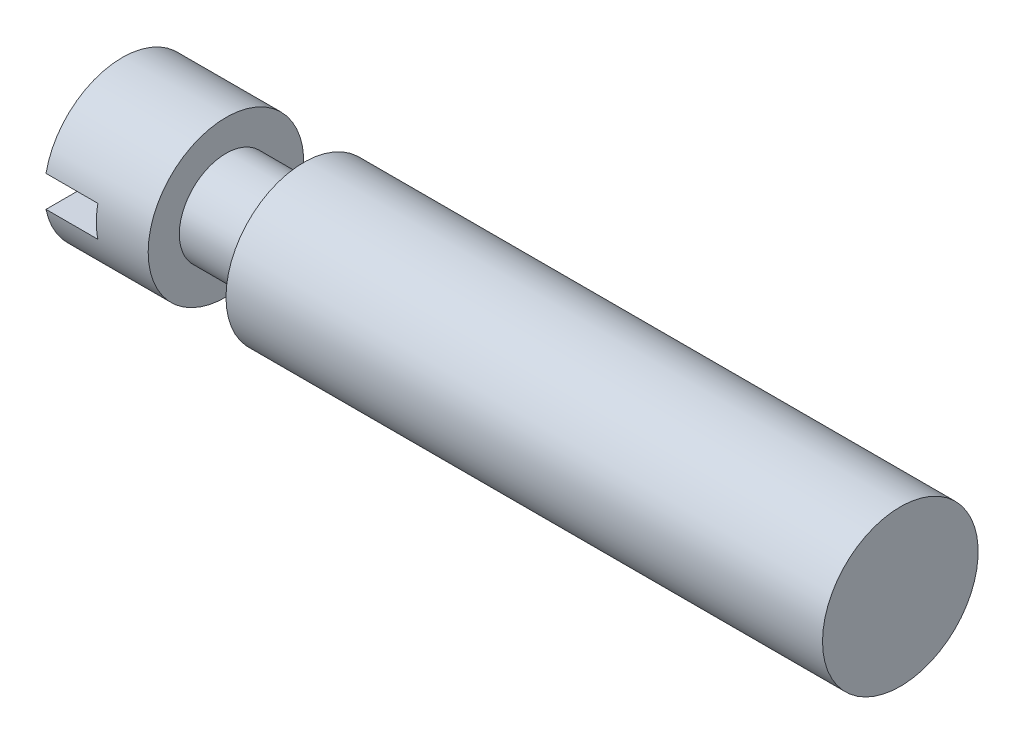
ISO-10303-21;
HEADER;
FILE_DESCRIPTION(('STEP AP214'),'2;1');
FILE_NAME('part.step','',(''),(''),'','','');
FILE_SCHEMA(('AUTOMOTIVE_DESIGN { 1 0 10303 214 1 1 1 1 }'));
ENDSEC;
DATA;
#1=APPLICATION_CONTEXT('core data for automotive mechanical design processes');
#2=APPLICATION_PROTOCOL_DEFINITION('international standard','automotive_design',2000,#1);
#3=PRODUCT_CONTEXT('',#1,'mechanical');
#4=PRODUCT('Part','Part','',(#3));
#5=PRODUCT_RELATED_PRODUCT_CATEGORY('part','',(#4));
#6=PRODUCT_DEFINITION_FORMATION('','',#4);
#7=PRODUCT_DEFINITION_CONTEXT('part definition',#1,'design');
#8=PRODUCT_DEFINITION('design','',#6,#7);
#9=PRODUCT_DEFINITION_SHAPE('','',#8);
#10=(LENGTH_UNIT() NAMED_UNIT(*) SI_UNIT(.MILLI.,.METRE.));
#11=(NAMED_UNIT(*) PLANE_ANGLE_UNIT() SI_UNIT($,.RADIAN.));
#12=(NAMED_UNIT(*) SI_UNIT($,.STERADIAN.) SOLID_ANGLE_UNIT());
#13=UNCERTAINTY_MEASURE_WITH_UNIT(LENGTH_MEASURE(1.E-05),#10,'distance_accuracy_value','');
#14=(GEOMETRIC_REPRESENTATION_CONTEXT(3) GLOBAL_UNCERTAINTY_ASSIGNED_CONTEXT((#13)) GLOBAL_UNIT_ASSIGNED_CONTEXT((#10,
#11,#12)) REPRESENTATION_CONTEXT('',''));
#15=CARTESIAN_POINT('',(0.,0.,0.));
#16=DIRECTION('',(0.,0.,1.));
#17=DIRECTION('',(1.,0.,0.));
#18=AXIS2_PLACEMENT_3D('',#15,#16,#17);
#19=CARTESIAN_POINT('',(0.,0.,0.));
#20=DIRECTION('',(1.,0.,0.));
#21=DIRECTION('',(0.,0.,-1.));
#22=AXIS2_PLACEMENT_3D('',#19,#20,#21);
#23=PLANE('',#22);
#24=CARTESIAN_POINT('',(0.,0.,0.));
#25=DIRECTION('',(-1.,0.,0.));
#26=DIRECTION('',(0.,0.,1.));
#27=AXIS2_PLACEMENT_3D('',#24,#25,#26);
#28=CIRCLE('',#27,3.);
#29=CARTESIAN_POINT('',(0.,0.6,2.93938769133981));
#30=VERTEX_POINT('',#29);
#31=CARTESIAN_POINT('',(0.,0.6,-2.93938769133981));
#32=VERTEX_POINT('',#31);
#33=EDGE_CURVE('E96',#30,#32,#28,.T.);
#34=ORIENTED_EDGE('',*,*,#33,.T.);
#35=DIRECTION('',(0.,0.,1.));
#36=VECTOR('',#35,1.);
#37=CARTESIAN_POINT('',(0.,0.6,-3.));
#38=LINE('',#37,#36);
#39=EDGE_CURVE('E112',#32,#30,#38,.T.);
#40=ORIENTED_EDGE('',*,*,#39,.T.);
#41=EDGE_LOOP('',(#34,#40));
#42=FACE_BOUND('',#41,.T.);
#43=ADVANCED_FACE('F37',(#42),#23,.F.);
#44=CARTESIAN_POINT('',(0.,-0.6,-2.93938769133981));
#45=VERTEX_POINT('',#44);
#46=CARTESIAN_POINT('',(0.,-0.6,2.93938769133981));
#47=VERTEX_POINT('',#46);
#48=EDGE_CURVE('E99',#45,#47,#28,.T.);
#49=ORIENTED_EDGE('',*,*,#48,.T.);
#50=DIRECTION('',(0.,0.,1.));
#51=VECTOR('',#50,1.);
#52=CARTESIAN_POINT('',(0.,-0.6,-3.));
#53=LINE('',#52,#51);
#54=EDGE_CURVE('E79',#45,#47,#53,.T.);
#55=ORIENTED_EDGE('',*,*,#54,.F.);
#56=EDGE_LOOP('',(#49,#55));
#57=FACE_BOUND('',#56,.T.);
#58=ADVANCED_FACE('F39',(#57),#23,.F.);
#59=CARTESIAN_POINT('',(0.,0.,0.));
#60=DIRECTION('',(-1.,0.,0.));
#61=DIRECTION('',(0.,0.,1.));
#62=AXIS2_PLACEMENT_3D('',#59,#60,#61);
#63=CYLINDRICAL_SURFACE('',#62,3.);
#64=CARTESIAN_POINT('',(2.,0.,0.));
#65=DIRECTION('',(1.,0.,0.));
#66=DIRECTION('',(0.,0.,-1.));
#67=AXIS2_PLACEMENT_3D('',#64,#65,#66);
#68=CIRCLE('',#67,3.);
#69=CARTESIAN_POINT('',(2.,-0.6,-2.93938769133981));
#70=VERTEX_POINT('',#69);
#71=CARTESIAN_POINT('',(2.,0.6,-2.93938769133981));
#72=VERTEX_POINT('',#71);
#73=EDGE_CURVE('E84',#70,#72,#68,.T.);
#74=ORIENTED_EDGE('',*,*,#73,.T.);
#75=DIRECTION('',(-1.,0.,0.));
#76=VECTOR('',#75,1.);
#77=CARTESIAN_POINT('',(0.,0.6,-2.93938769133981));
#78=LINE('',#77,#76);
#79=EDGE_CURVE('E11',#72,#32,#78,.T.);
#80=ORIENTED_EDGE('',*,*,#79,.T.);
#81=ORIENTED_EDGE('',*,*,#33,.F.);
#82=DIRECTION('',(-1.,0.,0.));
#83=VECTOR('',#82,1.);
#84=CARTESIAN_POINT('',(0.,0.6,2.93938769133981));
#85=LINE('',#84,#83);
#86=CARTESIAN_POINT('',(2.,0.6,2.93938769133981));
#87=VERTEX_POINT('',#86);
#88=EDGE_CURVE('E45',#30,#87,#85,.F.);
#89=ORIENTED_EDGE('',*,*,#88,.T.);
#90=CARTESIAN_POINT('',(2.,-0.6,2.93938769133981));
#91=VERTEX_POINT('',#90);
#92=EDGE_CURVE('E85',#87,#91,#68,.T.);
#93=ORIENTED_EDGE('',*,*,#92,.T.);
#94=DIRECTION('',(-1.,0.,0.));
#95=VECTOR('',#94,1.);
#96=CARTESIAN_POINT('',(0.,-0.6,2.93938769133981));
#97=LINE('',#96,#95);
#98=EDGE_CURVE('E76',#91,#47,#97,.T.);
#99=ORIENTED_EDGE('',*,*,#98,.T.);
#100=ORIENTED_EDGE('',*,*,#48,.F.);
#101=DIRECTION('',(-1.,0.,0.));
#102=VECTOR('',#101,1.);
#103=CARTESIAN_POINT('',(0.,-0.6,-2.93938769133981));
#104=LINE('',#103,#102);
#105=EDGE_CURVE('E101',#45,#70,#104,.F.);
#106=ORIENTED_EDGE('',*,*,#105,.T.);
#107=EDGE_LOOP('',(#74,#80,#81,#89,#93,#99,#100,#106));
#108=FACE_BOUND('',#107,.T.);
#109=CARTESIAN_POINT('',(4.,0.,0.));
#110=DIRECTION('',(-1.,0.,0.));
#111=DIRECTION('',(0.,0.,1.));
#112=AXIS2_PLACEMENT_3D('',#109,#110,#111);
#113=CIRCLE('',#112,3.);
#114=CARTESIAN_POINT('',(4.,0.,3.));
#115=VERTEX_POINT('',#114);
#116=EDGE_CURVE('E121',#115,#115,#113,.T.);
#117=ORIENTED_EDGE('',*,*,#116,.T.);
#118=EDGE_LOOP('',(#117));
#119=FACE_BOUND('',#118,.T.);
#120=ADVANCED_FACE('F93',(#108,#119),#63,.T.);
#121=CARTESIAN_POINT('',(4.,3.,0.));
#122=DIRECTION('',(-1.,0.,0.));
#123=DIRECTION('',(0.,0.,1.));
#124=AXIS2_PLACEMENT_3D('',#121,#122,#123);
#125=PLANE('',#124);
#126=ORIENTED_EDGE('',*,*,#116,.F.);
#127=EDGE_LOOP('',(#126));
#128=FACE_BOUND('',#127,.T.);
#129=CARTESIAN_POINT('',(4.,0.,0.));
#130=DIRECTION('',(-1.,0.,0.));
#131=DIRECTION('',(0.,0.,1.));
#132=AXIS2_PLACEMENT_3D('',#129,#130,#131);
#133=CIRCLE('',#132,1.8);
#134=CARTESIAN_POINT('',(4.,0.,1.8));
#135=VERTEX_POINT('',#134);
#136=EDGE_CURVE('E118',#135,#135,#133,.T.);
#137=ORIENTED_EDGE('',*,*,#136,.T.);
#138=EDGE_LOOP('',(#137));
#139=FACE_BOUND('',#138,.T.);
#140=ADVANCED_FACE('F125',(#128,#139),#125,.F.);
#141=CARTESIAN_POINT('',(0.,0.,0.));
#142=DIRECTION('',(-1.,0.,0.));
#143=DIRECTION('',(0.,0.,1.));
#144=AXIS2_PLACEMENT_3D('',#141,#142,#143);
#145=CYLINDRICAL_SURFACE('',#144,1.8);
#146=ORIENTED_EDGE('',*,*,#136,.F.);
#147=EDGE_LOOP('',(#146));
#148=FACE_BOUND('',#147,.T.);
#149=CARTESIAN_POINT('',(7.,0.,0.));
#150=DIRECTION('',(-1.,0.,0.));
#151=DIRECTION('',(0.,0.,1.));
#152=AXIS2_PLACEMENT_3D('',#149,#150,#151);
#153=CIRCLE('',#152,1.8);
#154=CARTESIAN_POINT('',(7.,0.,1.8));
#155=VERTEX_POINT('',#154);
#156=EDGE_CURVE('E115',#155,#155,#153,.T.);
#157=ORIENTED_EDGE('',*,*,#156,.T.);
#158=EDGE_LOOP('',(#157));
#159=FACE_BOUND('',#158,.T.);
#160=ADVANCED_FACE('F128',(#148,#159),#145,.T.);
#161=CARTESIAN_POINT('',(7.,1.8,0.));
#162=DIRECTION('',(1.,0.,0.));
#163=DIRECTION('',(0.,0.,-1.));
#164=AXIS2_PLACEMENT_3D('',#161,#162,#163);
#165=PLANE('',#164);
#166=ORIENTED_EDGE('',*,*,#156,.F.);
#167=EDGE_LOOP('',(#166));
#168=FACE_BOUND('',#167,.T.);
#169=CARTESIAN_POINT('',(7.,0.,0.));
#170=DIRECTION('',(-1.,0.,0.));
#171=DIRECTION('',(0.,0.,1.));
#172=AXIS2_PLACEMENT_3D('',#169,#170,#171);
#173=CIRCLE('',#172,3.);
#174=CARTESIAN_POINT('',(7.,0.,3.));
#175=VERTEX_POINT('',#174);
#176=EDGE_CURVE('E111',#175,#175,#173,.T.);
#177=ORIENTED_EDGE('',*,*,#176,.T.);
#178=EDGE_LOOP('',(#177));
#179=FACE_BOUND('',#178,.T.);
#180=ADVANCED_FACE('F134',(#168,#179),#165,.F.);
#181=CARTESIAN_POINT('',(0.,0.,0.));
#182=DIRECTION('',(-1.,0.,0.));
#183=DIRECTION('',(0.,0.,1.));
#184=AXIS2_PLACEMENT_3D('',#181,#182,#183);
#185=CYLINDRICAL_SURFACE('',#184,3.);
#186=ORIENTED_EDGE('',*,*,#176,.F.);
#187=EDGE_LOOP('',(#186));
#188=FACE_BOUND('',#187,.T.);
#189=CARTESIAN_POINT('',(30.,0.,0.));
#190=DIRECTION('',(-1.,0.,0.));
#191=DIRECTION('',(0.,0.,1.));
#192=AXIS2_PLACEMENT_3D('',#189,#190,#191);
#193=CIRCLE('',#192,3.);
#194=CARTESIAN_POINT('',(30.,0.,3.));
#195=VERTEX_POINT('',#194);
#196=EDGE_CURVE('E108',#195,#195,#193,.T.);
#197=ORIENTED_EDGE('',*,*,#196,.T.);
#198=EDGE_LOOP('',(#197));
#199=FACE_BOUND('',#198,.T.);
#200=ADVANCED_FACE('F140',(#188,#199),#185,.T.);
#201=CARTESIAN_POINT('',(30.,0.,0.));
#202=DIRECTION('',(-1.,0.,0.));
#203=DIRECTION('',(0.,0.,1.));
#204=AXIS2_PLACEMENT_3D('',#201,#202,#203);
#205=PLANE('',#204);
#206=ORIENTED_EDGE('',*,*,#196,.F.);
#207=EDGE_LOOP('',(#206));
#208=FACE_BOUND('',#207,.T.);
#209=ADVANCED_FACE('F146',(#208),#205,.F.);
#210=CARTESIAN_POINT('',(0.,0.6,-3.));
#211=DIRECTION('',(0.,1.,0.));
#212=DIRECTION('',(0.,0.,1.));
#213=AXIS2_PLACEMENT_3D('',#210,#211,#212);
#214=PLANE('',#213);
#215=DIRECTION('',(0.,0.,1.));
#216=VECTOR('',#215,1.);
#217=CARTESIAN_POINT('',(2.,0.6,-3.));
#218=LINE('',#217,#216);
#219=EDGE_CURVE('E91',#72,#87,#218,.T.);
#220=ORIENTED_EDGE('',*,*,#219,.T.);
#221=ORIENTED_EDGE('',*,*,#88,.F.);
#222=ORIENTED_EDGE('',*,*,#39,.F.);
#223=ORIENTED_EDGE('',*,*,#79,.F.);
#224=EDGE_LOOP('',(#220,#221,#222,#223));
#225=FACE_BOUND('',#224,.T.);
#226=ADVANCED_FACE('F151',(#225),#214,.F.);
#227=CARTESIAN_POINT('',(2.,-0.6,-3.));
#228=DIRECTION('',(1.,0.,0.));
#229=DIRECTION('',(0.,0.,-1.));
#230=AXIS2_PLACEMENT_3D('',#227,#228,#229);
#231=PLANE('',#230);
#232=ORIENTED_EDGE('',*,*,#219,.F.);
#233=ORIENTED_EDGE('',*,*,#73,.F.);
#234=DIRECTION('',(0.,0.,1.));
#235=VECTOR('',#234,1.);
#236=CARTESIAN_POINT('',(2.,-0.6,-3.));
#237=LINE('',#236,#235);
#238=EDGE_CURVE('E52',#70,#91,#237,.T.);
#239=ORIENTED_EDGE('',*,*,#238,.T.);
#240=ORIENTED_EDGE('',*,*,#92,.F.);
#241=EDGE_LOOP('',(#232,#233,#239,#240));
#242=FACE_BOUND('',#241,.T.);
#243=ADVANCED_FACE('F89',(#242),#231,.F.);
#244=CARTESIAN_POINT('',(0.,-0.6,-3.));
#245=DIRECTION('',(0.,-1.,0.));
#246=DIRECTION('',(0.,0.,-1.));
#247=AXIS2_PLACEMENT_3D('',#244,#245,#246);
#248=PLANE('',#247);
#249=ORIENTED_EDGE('',*,*,#238,.F.);
#250=ORIENTED_EDGE('',*,*,#105,.F.);
#251=ORIENTED_EDGE('',*,*,#54,.T.);
#252=ORIENTED_EDGE('',*,*,#98,.F.);
#253=EDGE_LOOP('',(#249,#250,#251,#252));
#254=FACE_BOUND('',#253,.T.);
#255=ADVANCED_FACE('F77',(#254),#248,.F.);
#256=CLOSED_SHELL('',(#43,#58,#120,#140,#160,#180,#200,#209,#226,#243,#255));
#257=MANIFOLD_SOLID_BREP('B2',#256);
#258=ADVANCED_BREP_SHAPE_REPRESENTATION('',(#18,#257),#14);
#259=SHAPE_DEFINITION_REPRESENTATION(#9,#258);
ENDSEC;
END-ISO-10303-21;
